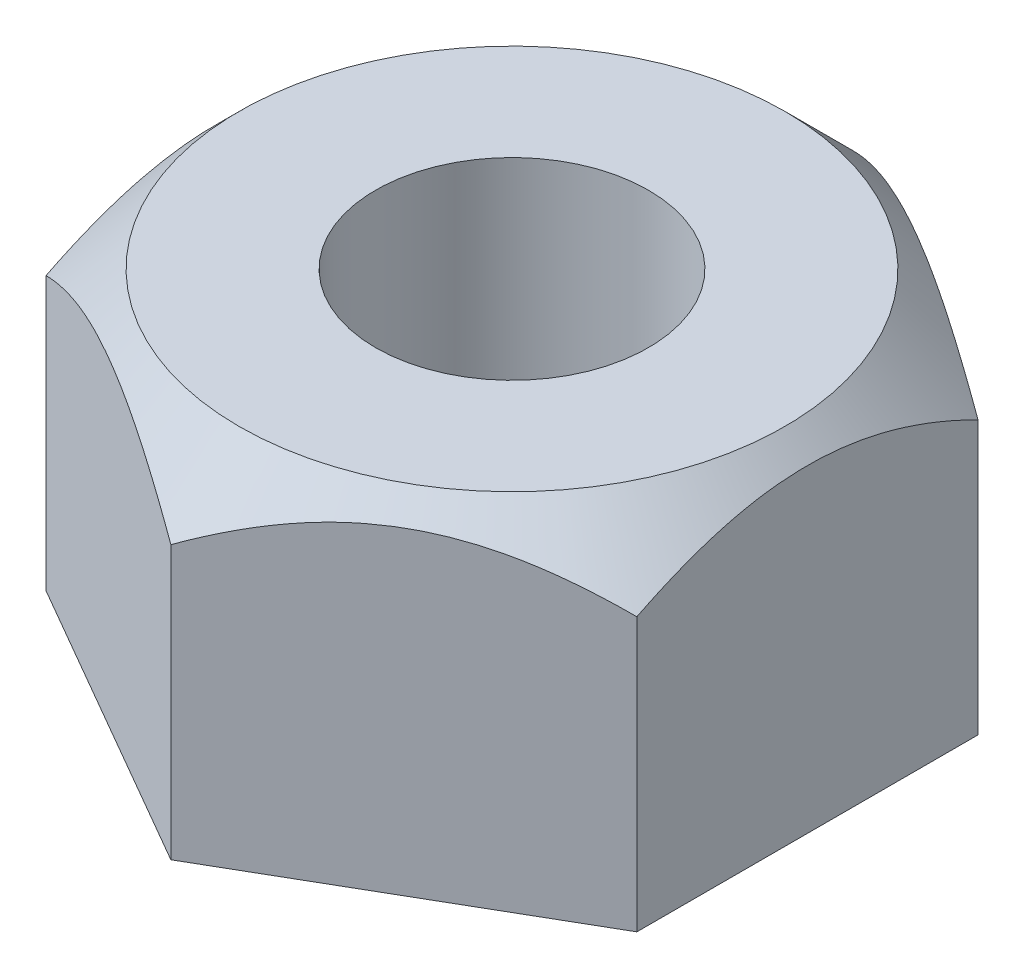
ISO-10303-21;
HEADER;
FILE_DESCRIPTION(('STEP AP214'),'2;1');
FILE_NAME('part.step','',(''),(''),'','','');
FILE_SCHEMA(('AUTOMOTIVE_DESIGN { 1 0 10303 214 1 1 1 1 }'));
ENDSEC;
DATA;
#1=APPLICATION_CONTEXT('core data for automotive mechanical design processes');
#2=APPLICATION_PROTOCOL_DEFINITION('international standard','automotive_design',2000,#1);
#3=PRODUCT_CONTEXT('',#1,'mechanical');
#4=PRODUCT('Part','Part','',(#3));
#5=PRODUCT_RELATED_PRODUCT_CATEGORY('part','',(#4));
#6=PRODUCT_DEFINITION_FORMATION('','',#4);
#7=PRODUCT_DEFINITION_CONTEXT('part definition',#1,'design');
#8=PRODUCT_DEFINITION('design','',#6,#7);
#9=PRODUCT_DEFINITION_SHAPE('','',#8);
#10=(LENGTH_UNIT() NAMED_UNIT(*) SI_UNIT(.MILLI.,.METRE.));
#11=(NAMED_UNIT(*) PLANE_ANGLE_UNIT() SI_UNIT($,.RADIAN.));
#12=(NAMED_UNIT(*) SI_UNIT($,.STERADIAN.) SOLID_ANGLE_UNIT());
#13=UNCERTAINTY_MEASURE_WITH_UNIT(LENGTH_MEASURE(1.E-05),#10,'distance_accuracy_value','');
#14=(GEOMETRIC_REPRESENTATION_CONTEXT(3) GLOBAL_UNCERTAINTY_ASSIGNED_CONTEXT((#13)) GLOBAL_UNIT_ASSIGNED_CONTEXT((#10,
#11,#12)) REPRESENTATION_CONTEXT('',''));
#15=CARTESIAN_POINT('',(0.,0.,0.));
#16=DIRECTION('',(0.,0.,1.));
#17=DIRECTION('',(1.,0.,0.));
#18=AXIS2_PLACEMENT_3D('',#15,#16,#17);
#19=CARTESIAN_POINT('',(0.,5.,0.));
#20=DIRECTION('',(0.,1.,0.));
#21=DIRECTION('',(0.,0.,1.));
#22=AXIS2_PLACEMENT_3D('',#19,#20,#21);
#23=PLANE('',#22);
#24=CARTESIAN_POINT('',(0.,5.,0.));
#25=DIRECTION('',(0.,-1.,0.));
#26=DIRECTION('',(0.,0.,-1.));
#27=AXIS2_PLACEMENT_3D('',#24,#25,#26);
#28=CIRCLE('',#27,3.99999999999996);
#29=CARTESIAN_POINT('',(0.,5.,-4.));
#30=VERTEX_POINT('',#29);
#31=EDGE_CURVE('E222',#30,#30,#28,.T.);
#32=ORIENTED_EDGE('',*,*,#31,.F.);
#33=EDGE_LOOP('',(#32));
#34=FACE_BOUND('',#33,.T.);
#35=CARTESIAN_POINT('',(0.,5.,0.));
#36=DIRECTION('',(0.,1.,0.));
#37=DIRECTION('',(0.,0.,1.));
#38=AXIS2_PLACEMENT_3D('',#35,#36,#37);
#39=CIRCLE('',#38,2.);
#40=CARTESIAN_POINT('',(0.,5.,2.));
#41=VERTEX_POINT('',#40);
#42=EDGE_CURVE('E137',#41,#41,#39,.T.);
#43=ORIENTED_EDGE('',*,*,#42,.F.);
#44=EDGE_LOOP('',(#43));
#45=FACE_BOUND('',#44,.T.);
#46=ADVANCED_FACE('F38',(#34,#45),#23,.T.);
#47=CARTESIAN_POINT('',(0.,0.,0.));
#48=DIRECTION('',(0.,1.,0.));
#49=DIRECTION('',(0.,0.,1.));
#50=AXIS2_PLACEMENT_3D('',#47,#48,#49);
#51=PLANE('',#50);
#52=DIRECTION('',(-0.866025403784441,0.,-0.499999999999995));
#53=VECTOR('',#52,1.);
#54=CARTESIAN_POINT('',(4.33012701892216,0.,-2.50000000000005));
#55=LINE('',#54,#53);
#56=CARTESIAN_POINT('',(4.33012701892216,0.,-2.50000000000005));
#57=VERTEX_POINT('',#56);
#58=CARTESIAN_POINT('',(0.,0.,-5.));
#59=VERTEX_POINT('',#58);
#60=EDGE_CURVE('E113',#57,#59,#55,.T.);
#61=ORIENTED_EDGE('',*,*,#60,.F.);
#62=DIRECTION('',(0.,0.,-1.));
#63=VECTOR('',#62,1.);
#64=CARTESIAN_POINT('',(4.33012701892222,0.,2.49999999999996));
#65=LINE('',#64,#63);
#66=CARTESIAN_POINT('',(4.33012701892222,0.,2.49999999999996));
#67=VERTEX_POINT('',#66);
#68=EDGE_CURVE('E123',#67,#57,#65,.T.);
#69=ORIENTED_EDGE('',*,*,#68,.F.);
#70=DIRECTION('',(0.866025403784434,0.,-0.500000000000007));
#71=VECTOR('',#70,1.);
#72=CARTESIAN_POINT('',(0.,0.,5.));
#73=LINE('',#72,#71);
#74=CARTESIAN_POINT('',(0.,0.,5.));
#75=VERTEX_POINT('',#74);
#76=EDGE_CURVE('E125',#75,#67,#73,.T.);
#77=ORIENTED_EDGE('',*,*,#76,.F.);
#78=DIRECTION('',(0.866025403784441,0.,0.499999999999995));
#79=VECTOR('',#78,1.);
#80=CARTESIAN_POINT('',(-4.33012701892218,0.,2.50000000000002));
#81=LINE('',#80,#79);
#82=CARTESIAN_POINT('',(-4.33012701892218,0.,2.50000000000002));
#83=VERTEX_POINT('',#82);
#84=EDGE_CURVE('E128',#83,#75,#81,.T.);
#85=ORIENTED_EDGE('',*,*,#84,.F.);
#86=DIRECTION('',(0.,0.,1.));
#87=VECTOR('',#86,1.);
#88=CARTESIAN_POINT('',(-4.3301270189222,0.,-2.49999999999999));
#89=LINE('',#88,#87);
#90=CARTESIAN_POINT('',(-4.3301270189222,0.,-2.49999999999999));
#91=VERTEX_POINT('',#90);
#92=EDGE_CURVE('E131',#91,#83,#89,.T.);
#93=ORIENTED_EDGE('',*,*,#92,.F.);
#94=DIRECTION('',(-0.866025403784438,0.,0.500000000000001));
#95=VECTOR('',#94,1.);
#96=CARTESIAN_POINT('',(0.,0.,-5.));
#97=LINE('',#96,#95);
#98=EDGE_CURVE('E134',#59,#91,#97,.T.);
#99=ORIENTED_EDGE('',*,*,#98,.F.);
#100=EDGE_LOOP('',(#61,#69,#77,#85,#93,#99));
#101=FACE_BOUND('',#100,.T.);
#102=CARTESIAN_POINT('',(0.,0.,0.));
#103=DIRECTION('',(0.,1.,0.));
#104=DIRECTION('',(0.,0.,1.));
#105=AXIS2_PLACEMENT_3D('',#102,#103,#104);
#106=CIRCLE('',#105,2.);
#107=CARTESIAN_POINT('',(0.,0.,2.));
#108=VERTEX_POINT('',#107);
#109=EDGE_CURVE('E102',#108,#108,#106,.T.);
#110=ORIENTED_EDGE('',*,*,#109,.T.);
#111=EDGE_LOOP('',(#110));
#112=FACE_BOUND('',#111,.T.);
#113=ADVANCED_FACE('F191',(#101,#112),#51,.F.);
#114=CARTESIAN_POINT('',(4.33012701892216,5.,-2.50000000000005));
#115=DIRECTION('',(-0.499999999999995,0.,0.866025403784441));
#116=DIRECTION('',(0.866025403784441,0.,0.499999999999995));
#117=AXIS2_PLACEMENT_3D('',#114,#115,#116);
#118=PLANE('',#117);
#119=DIRECTION('',(0.,-1.,0.));
#120=VECTOR('',#119,1.);
#121=CARTESIAN_POINT('',(0.,5.,-5.));
#122=LINE('',#121,#120);
#123=CARTESIAN_POINT('',(0.,4.,-5.));
#124=VERTEX_POINT('',#123);
#125=EDGE_CURVE('E53',#124,#59,#122,.T.);
#126=ORIENTED_EDGE('',*,*,#125,.F.);
#127=CARTESIAN_POINT('',(-0.0002,3.99988452594625,-5.00011547005384));
#128=CARTESIAN_POINT('',(0.0742554090707049,4.04286790141724,-4.95712861958424));
#129=CARTESIAN_POINT('',(0.149283126568601,4.08453221602492,-4.91381134669015));
#130=CARTESIAN_POINT('',(0.300595465189509,4.16482145708143,-4.82645112725566));
#131=CARTESIAN_POINT('',(0.376880745694235,4.20344472346906,-4.78240780002105));
#132=CARTESIAN_POINT('',(0.608500126942155,4.31448044206776,-4.64868228790803));
#133=CARTESIAN_POINT('',(0.765795048817964,4.38158509551093,-4.55786802242087));
#134=CARTESIAN_POINT('',(1.08299287715965,4.49649734778531,-4.37473377084144));
#135=CARTESIAN_POINT('',(1.24281470248161,4.54459446311372,-4.28246059696943));
#136=CARTESIAN_POINT('',(1.48517508809477,4.60023112471791,-4.14253376309477));
#137=CARTESIAN_POINT('',(1.56631871630185,4.616017735568,-4.09568546750639));
#138=CARTESIAN_POINT('',(1.72929306006518,4.6417307019677,-4.00159218626363));
#139=CARTESIAN_POINT('',(1.81112367107163,4.65165793340976,-3.9543472609711));
#140=CARTESIAN_POINT('',(2.0105305936331,4.66830217314388,-3.83921962055197));
#141=CARTESIAN_POINT('',(2.12832175242251,4.67179465880338,-3.77121286331674));
#142=CARTESIAN_POINT('',(2.36369180162404,4.66593410386714,-3.63532190205107));
#143=CARTESIAN_POINT('',(2.48127060316034,4.65657656026427,-3.56743774933309));
#144=CARTESIAN_POINT('',(2.71531972801062,4.62556753841816,-3.43230942409718));
#145=CARTESIAN_POINT('',(2.83178866321259,4.6039023105296,-3.3650660530061));
#146=CARTESIAN_POINT('',(3.06272472930427,4.54945578592571,-3.23173505308248));
#147=CARTESIAN_POINT('',(3.17719201297257,4.51667534152197,-3.16564733604318));
#148=CARTESIAN_POINT('',(3.38039775482073,4.44923386131425,-3.04832644628627));
#149=CARTESIAN_POINT('',(3.46958605899213,4.41634609377105,-2.99683355486435));
#150=CARTESIAN_POINT('',(3.64636152947374,4.34527048015554,-2.89477218939567));
#151=CARTESIAN_POINT('',(3.73394864701728,4.30708247295943,-2.84420374350436));
#152=CARTESIAN_POINT('',(3.90724588546534,4.22626249862793,-2.74415053623656));
#153=CARTESIAN_POINT('',(3.99296093516109,4.18364450612329,-2.69466292922111));
#154=CARTESIAN_POINT('',(4.16280372218375,4.09452416373329,-2.59660415041366));
#155=CARTESIAN_POINT('',(4.24693239497665,4.04802419677493,-2.54803243853012));
#156=CARTESIAN_POINT('',(4.33032701892216,3.99988452594623,-2.49988452994621));
#157=B_SPLINE_CURVE_WITH_KNOTS('',3,(#127,#128,#129,#130,#131,#132,#133,#134,#135,#136,#137,
#138,#139,#140,#141,#142,#143,#144,#145,#146,#147,#148,#149,#150,#151,#152,#153,#154,#155,#156),
.UNSPECIFIED.,.F.,.F.,(4,2,2,2,2,2,2,2,2,2,2,2,2,2,4),(0.,0.288343025050057,0.576842376266659,
1.1569560499233,1.72785747296509,2.01274823950899,2.29759640821259,2.70513724110399,
3.11282092407134,3.52096095288673,3.92906969271699,4.25324617843564,4.57743252106517,
4.90062556888116,5.22362166510132),.UNSPECIFIED.);
#158=CARTESIAN_POINT('',(4.33012701892216,4.,-2.50000000000001));
#159=VERTEX_POINT('',#158);
#160=EDGE_CURVE('E96',#124,#159,#157,.T.);
#161=ORIENTED_EDGE('',*,*,#160,.T.);
#162=DIRECTION('',(0.,-1.,0.));
#163=VECTOR('',#162,1.);
#164=CARTESIAN_POINT('',(4.33012701892216,5.,-2.50000000000005));
#165=LINE('',#164,#163);
#166=EDGE_CURVE('E67',#159,#57,#165,.T.);
#167=ORIENTED_EDGE('',*,*,#166,.T.);
#168=ORIENTED_EDGE('',*,*,#60,.T.);
#169=EDGE_LOOP('',(#126,#161,#167,#168));
#170=FACE_BOUND('',#169,.T.);
#171=ADVANCED_FACE('F40',(#170),#118,.F.);
#172=CARTESIAN_POINT('',(0.,5.,-5.));
#173=DIRECTION('',(0.500000000000001,0.,0.866025403784438));
#174=DIRECTION('',(0.866025403784438,0.,-0.500000000000001));
#175=AXIS2_PLACEMENT_3D('',#172,#173,#174);
#176=PLANE('',#175);
#177=DIRECTION('',(0.,-1.,0.));
#178=VECTOR('',#177,1.);
#179=CARTESIAN_POINT('',(-4.3301270189222,5.,-2.49999999999999));
#180=LINE('',#179,#178);
#181=CARTESIAN_POINT('',(-4.3301270189222,4.,-2.49999999999995));
#182=VERTEX_POINT('',#181);
#183=EDGE_CURVE('E109',#182,#91,#180,.T.);
#184=ORIENTED_EDGE('',*,*,#183,.F.);
#185=CARTESIAN_POINT('',(-4.3303270189222,3.99988452594623,-2.49988452994615));
#186=CARTESIAN_POINT('',(-4.25587160985149,4.04286790141722,-2.54287138041575));
#187=CARTESIAN_POINT('',(-4.18084389235359,4.08453221602491,-2.58618865330984));
#188=CARTESIAN_POINT('',(-4.02953155373268,4.16482145708142,-2.67354887274434));
#189=CARTESIAN_POINT('',(-3.95324627322796,4.20344472346905,-2.71759219997895));
#190=CARTESIAN_POINT('',(-3.72162689198003,4.31448044206776,-2.85131771209197));
#191=CARTESIAN_POINT('',(-3.56433197010422,4.38158509551093,-2.94213197757913));
#192=CARTESIAN_POINT('',(-3.24713414176253,4.49649734778531,-3.12526622915858));
#193=CARTESIAN_POINT('',(-3.08731231644056,4.54459446311372,-3.21753940303059));
#194=CARTESIAN_POINT('',(-2.84495193082739,4.60023112471792,-3.35746623690525));
#195=CARTESIAN_POINT('',(-2.76380830262031,4.61601773556801,-3.40431453249364));
#196=CARTESIAN_POINT('',(-2.60083395885698,4.64173070196772,-3.4984078137364));
#197=CARTESIAN_POINT('',(-2.51900334785053,4.65165793340977,-3.54565273902892));
#198=CARTESIAN_POINT('',(-2.31959642528906,4.6683021731439,-3.66078037944806));
#199=CARTESIAN_POINT('',(-2.20180526649965,4.67179465880339,-3.72878713668329));
#200=CARTESIAN_POINT('',(-1.96643521729812,4.66593410386716,-3.86467809794896));
#201=CARTESIAN_POINT('',(-1.84885641576182,4.65657656026429,-3.93256225066694));
#202=CARTESIAN_POINT('',(-1.61480729091154,4.62556753841818,-4.06769057590285));
#203=CARTESIAN_POINT('',(-1.49833835570958,4.60390231052962,-4.13493394699393));
#204=CARTESIAN_POINT('',(-1.26740228961789,4.54945578592573,-4.26826494691756));
#205=CARTESIAN_POINT('',(-1.1529350059496,4.51667534152199,-4.33435266395685));
#206=CARTESIAN_POINT('',(-0.949729264101441,4.44923386131427,-4.45167355371377));
#207=CARTESIAN_POINT('',(-0.860540959930038,4.41634609377107,-4.50316644513569));
#208=CARTESIAN_POINT('',(-0.68376548944843,4.34527048015556,-4.60522781060437));
#209=CARTESIAN_POINT('',(-0.596178371904884,4.30708247295946,-4.65579625649568));
#210=CARTESIAN_POINT('',(-0.422881133456828,4.22626249862795,-4.75584946376349));
#211=CARTESIAN_POINT('',(-0.337166083761076,4.18364450612331,-4.80533707077893));
#212=CARTESIAN_POINT('',(-0.16732329673841,4.09452416373332,-4.90339584958638));
#213=CARTESIAN_POINT('',(-0.0831946239455089,4.04802419677496,-4.95196756146993));
#214=CARTESIAN_POINT('',(0.000200000000000395,3.99988452594625,-5.00011547005384));
#215=B_SPLINE_CURVE_WITH_KNOTS('',3,(#185,#186,#187,#188,#189,#190,#191,#192,#193,#194,#195,
#196,#197,#198,#199,#200,#201,#202,#203,#204,#205,#206,#207,#208,#209,#210,#211,#212,#213,#214),
.UNSPECIFIED.,.F.,.F.,(4,2,2,2,2,2,2,2,2,2,2,2,2,2,4),(0.,0.288343025050065,0.576842376266673,
1.15695604992333,1.72785747296514,2.01274823950905,2.29759640821265,2.70513724110406,
3.11282092407141,3.52096095288679,3.92906969271705,4.2532461784357,4.57743252106523,
4.90062556888122,5.22362166510139),.UNSPECIFIED.);
#216=EDGE_CURVE('E99',#182,#124,#215,.T.);
#217=ORIENTED_EDGE('',*,*,#216,.T.);
#218=ORIENTED_EDGE('',*,*,#125,.T.);
#219=ORIENTED_EDGE('',*,*,#98,.T.);
#220=EDGE_LOOP('',(#184,#217,#218,#219));
#221=FACE_BOUND('',#220,.T.);
#222=ADVANCED_FACE('F106',(#221),#176,.F.);
#223=CARTESIAN_POINT('',(-4.3301270189222,5.,-2.49999999999999));
#224=DIRECTION('',(1.,0.,0.));
#225=DIRECTION('',(0.,0.,-1.));
#226=AXIS2_PLACEMENT_3D('',#223,#224,#225);
#227=PLANE('',#226);
#228=DIRECTION('',(0.,-1.,0.));
#229=VECTOR('',#228,1.);
#230=CARTESIAN_POINT('',(-4.33012701892218,5.,2.50000000000002));
#231=LINE('',#230,#229);
#232=CARTESIAN_POINT('',(-4.33012701892207,4.,2.50000000000009));
#233=VERTEX_POINT('',#232);
#234=EDGE_CURVE('E114',#233,#83,#231,.T.);
#235=ORIENTED_EDGE('',*,*,#234,.F.);
#236=CARTESIAN_POINT('',(-4.33012701892217,0.253678646666877,7.59921951359281));
#237=CARTESIAN_POINT('',(-4.33012701892217,0.351184265632849,7.48699247756584));
#238=CARTESIAN_POINT('',(-4.33012701892217,0.448391375057718,7.37450605913899));
#239=CARTESIAN_POINT('',(-4.33012701892217,0.642124786155439,7.14894544849835));
#240=CARTESIAN_POINT('',(-4.33012701892217,0.738651076776384,7.03587124679443));
#241=CARTESIAN_POINT('',(-4.33012701892217,1.02716624616897,6.69556519020096));
#242=CARTESIAN_POINT('',(-4.33012701892217,1.21800207958187,6.46735241242825));
#243=CARTESIAN_POINT('',(-4.33012701892217,1.59990517797504,6.00244910758806));
#244=CARTESIAN_POINT('',(-4.33012701892217,1.79088117220909,5.76568333547583));
#245=CARTESIAN_POINT('',(-4.33012701892217,2.16711212032232,5.28773027314546));
#246=CARTESIAN_POINT('',(-4.33012701892217,2.35236849100331,5.04654410187624));
#247=CARTESIAN_POINT('',(-4.33012701892217,2.71525397312859,4.55795427576487));
#248=CARTESIAN_POINT('',(-4.33012701892218,2.89287299343635,4.31054304061882));
#249=CARTESIAN_POINT('',(-4.33012701892218,3.15077503816679,3.93341818828449));
#250=CARTESIAN_POINT('',(-4.33012701892218,3.23535920031472,3.80664733518686));
#251=CARTESIAN_POINT('',(-4.33012701892218,3.40099683530629,3.55082533863258));
#252=CARTESIAN_POINT('',(-4.33012701892218,3.48205061253224,3.42177439311459));
#253=CARTESIAN_POINT('',(-4.33012701892218,3.63925189418196,3.16199806432159));
#254=CARTESIAN_POINT('',(-4.33012701892218,3.7154310235147,3.03129190461665));
#255=CARTESIAN_POINT('',(-4.33012701892218,3.86251884492208,2.7669085874914));
#256=CARTESIAN_POINT('',(-4.33012701892218,3.93342690129371,2.63323107423656));
#257=CARTESIAN_POINT('',(-4.33012701892218,4.06857379693264,2.36276633080915));
#258=CARTESIAN_POINT('',(-4.33012701892218,4.13282229705243,2.22598396638433));
#259=CARTESIAN_POINT('',(-4.33012701892218,4.25314426880829,1.94889793365953));
#260=CARTESIAN_POINT('',(-4.33012701892218,4.30922090004818,1.80859565104085));
#261=CARTESIAN_POINT('',(-4.33012701892218,4.41248158383951,1.5210910162557));
#262=CARTESIAN_POINT('',(-4.33012701892219,4.459434008593,1.37380428933832));
#263=CARTESIAN_POINT('',(-4.33012701892219,4.54055726771458,1.07571750853242));
#264=CARTESIAN_POINT('',(-4.33012701892219,4.57473013843067,0.924918018453896));
#265=CARTESIAN_POINT('',(-4.33012701892219,4.62800973590169,0.621622317866126));
#266=CARTESIAN_POINT('',(-4.33012701892219,4.64721141825836,0.469143126259003));
#267=CARTESIAN_POINT('',(-4.33012701892219,4.66949383146878,0.163002209399457));
#268=CARTESIAN_POINT('',(-4.33012701892219,4.67257642516733,0.00934062284924474));
#269=CARTESIAN_POINT('',(-4.33012701892219,4.66237027194922,-0.297696033322777));
#270=CARTESIAN_POINT('',(-4.33012701892219,4.64905273739304,-0.451070124483334));
#271=CARTESIAN_POINT('',(-4.33012701892219,4.6070212422452,-0.755678508307873));
#272=CARTESIAN_POINT('',(-4.33012701892219,4.57830417588683,-0.906912363013293));
#273=CARTESIAN_POINT('',(-4.33012701892219,4.50712812371406,-1.20721128847463));
#274=CARTESIAN_POINT('',(-4.3301270189222,4.46457099038751,-1.35625267713974));
#275=CARTESIAN_POINT('',(-4.3301270189222,4.36805262314037,-1.65053794073625));
#276=CARTESIAN_POINT('',(-4.3301270189222,4.31409117797903,-1.79578174526944));
#277=CARTESIAN_POINT('',(-4.3301270189222,4.18441751502987,-2.11307073215614));
#278=CARTESIAN_POINT('',(-4.3301270189222,4.10652126399939,-2.28421549179873));
#279=CARTESIAN_POINT('',(-4.3301270189222,3.94032519516517,-2.62142059572486));
#280=CARTESIAN_POINT('',(-4.3301270189222,3.85201941400982,-2.78747795627216));
#281=CARTESIAN_POINT('',(-4.3301270189222,3.66731103609871,-3.11543948043555));
#282=CARTESIAN_POINT('',(-4.3301270189222,3.57089216867296,-3.27733440507162));
#283=CARTESIAN_POINT('',(-4.3301270189222,3.3719729247574,-3.59727339089179));
#284=CARTESIAN_POINT('',(-4.3301270189222,3.26947374655535,-3.75531820223987));
#285=CARTESIAN_POINT('',(-4.3301270189222,3.05916109783683,-4.06905173475921));
#286=CARTESIAN_POINT('',(-4.3301270189222,2.95132197417666,-4.22472317767926));
#287=CARTESIAN_POINT('',(-4.33012701892221,2.73185307244256,-4.53336890520683));
#288=CARTESIAN_POINT('',(-4.33012701892221,2.6202231588763,-4.68634309311017));
#289=CARTESIAN_POINT('',(-4.33012701892221,2.39406517485042,-4.98984972858034));
#290=CARTESIAN_POINT('',(-4.33012701892221,2.27954064324082,-5.14038482040814));
#291=CARTESIAN_POINT('',(-4.33012701892221,2.04803503761645,-5.43955784308427));
#292=CARTESIAN_POINT('',(-4.33012701892221,1.93105388249028,-5.58819571102981));
#293=CARTESIAN_POINT('',(-4.33012701892221,1.68603900594879,-5.89518635745016));
#294=CARTESIAN_POINT('',(-4.33012701892221,1.55784508755709,-6.05341108869284));
#295=CARTESIAN_POINT('',(-4.33012701892221,1.29954321420474,-6.36829125211622));
#296=CARTESIAN_POINT('',(-4.33012701892221,1.16943523517162,-6.52494666451842));
#297=CARTESIAN_POINT('',(-4.33012701892221,0.909100774007249,-6.83518118684619));
#298=CARTESIAN_POINT('',(-4.33012701892221,0.778891912024043,-6.98877510446432));
#299=CARTESIAN_POINT('',(-4.33012701892221,0.51719336283557,-7.29480873067968));
#300=CARTESIAN_POINT('',(-4.33012701892221,0.385703969827631,-7.4472486907282));
#301=CARTESIAN_POINT('',(-4.33012701892221,0.253678646666957,-7.59921951359278));
#302=B_SPLINE_CURVE_WITH_KNOTS('',3,(#236,#237,#238,#239,#240,#241,#242,#243,#244,#245,#246,
#247,#248,#249,#250,#251,#252,#253,#254,#255,#256,#257,#258,#259,#260,#261,#262,#263,#264,#265,
#266,#267,#268,#269,#270,#271,#272,#273,#274,#275,#276,#277,#278,#279,#280,#281,#282,#283,#284,
#285,#286,#287,#288,#289,#290,#291,#292,#293,#294,#295,#296,#297,#298,#299,#300,#301),
.UNSPECIFIED.,.F.,.F.,(4,2,2,2,2,2,2,2,2,2,2,2,2,2,2,2,2,2,2,2,2,2,2,2,2,2,2,2,2,2,2,2,4),(0.,
0.446003957696263,0.892015138902993,1.7844454520532,2.69694127159322,3.60920921409762,
4.52264764303549,4.97979846611422,5.43690979628033,5.89066842739228,6.3444816943095,
6.79762713021699,7.25059689265082,7.71388352952144,8.1770963128597,8.63734668751585,
9.09754387095332,9.55855000507361,10.0196491495725,10.4840922330261,10.9485439200596,
11.5121821150825,12.0761447876207,12.6412667411846,13.2062776900008,13.7743322928723,
14.3424072208553,14.9098183649613,15.4772482730702,16.0881462572516,16.6990519310607,
17.303121069493,17.9070545540327),.UNSPECIFIED.);
#303=EDGE_CURVE('E110',#233,#182,#302,.T.);
#304=ORIENTED_EDGE('',*,*,#303,.T.);
#305=ORIENTED_EDGE('',*,*,#183,.T.);
#306=ORIENTED_EDGE('',*,*,#92,.T.);
#307=EDGE_LOOP('',(#235,#304,#305,#306));
#308=FACE_BOUND('',#307,.T.);
#309=ADVANCED_FACE('F180',(#308),#227,.F.);
#310=CARTESIAN_POINT('',(-4.33012701892218,5.,2.50000000000002));
#311=DIRECTION('',(0.499999999999995,0.,-0.866025403784442));
#312=DIRECTION('',(-0.866025403784442,0.,-0.499999999999995));
#313=AXIS2_PLACEMENT_3D('',#310,#311,#312);
#314=PLANE('',#313);
#315=DIRECTION('',(0.,-1.,0.));
#316=VECTOR('',#315,1.);
#317=CARTESIAN_POINT('',(0.,5.,5.));
#318=LINE('',#317,#316);
#319=CARTESIAN_POINT('',(1.88651178012478E-13,4.,4.99999999999991));
#320=VERTEX_POINT('',#319);
#321=EDGE_CURVE('E118',#320,#75,#318,.T.);
#322=ORIENTED_EDGE('',*,*,#321,.F.);
#323=CARTESIAN_POINT('',(0.000200000000034515,3.99988452594617,5.00011547005384));
#324=CARTESIAN_POINT('',(-0.0742554090706722,4.04286790141715,4.95712861958424));
#325=CARTESIAN_POINT('',(-0.149283126568571,4.08453221602484,4.91381134669015));
#326=CARTESIAN_POINT('',(-0.300595465189481,4.16482145708135,4.82645112725565));
#327=CARTESIAN_POINT('',(-0.376880745694209,4.20344472346898,4.78240780002104));
#328=CARTESIAN_POINT('',(-0.608500126942136,4.31448044206769,4.64868228790802));
#329=CARTESIAN_POINT('',(-0.765795048817949,4.38158509551086,4.55786802242086));
#330=CARTESIAN_POINT('',(-1.08299287715965,4.49649734778524,4.37473377084142));
#331=CARTESIAN_POINT('',(-1.24281470248161,4.54459446311365,4.28246059696941));
#332=CARTESIAN_POINT('',(-1.48517508809478,4.60023112471785,4.14253376309474));
#333=CARTESIAN_POINT('',(-1.56631871630186,4.61601773556794,4.09568546750636));
#334=CARTESIAN_POINT('',(-1.72929306006519,4.64173070196764,4.0015921862636));
#335=CARTESIAN_POINT('',(-1.81112367107165,4.6516579334097,3.95434726097107));
#336=CARTESIAN_POINT('',(-2.01053059363312,4.66830217314382,3.83921962055194));
#337=CARTESIAN_POINT('',(-2.12832175242253,4.67179465880332,3.77121286331671));
#338=CARTESIAN_POINT('',(-2.36369180162406,4.66593410386708,3.63532190205103));
#339=CARTESIAN_POINT('',(-2.48127060316037,4.65657656026421,3.56743774933306));
#340=CARTESIAN_POINT('',(-2.71531972801065,4.6255675384181,3.43230942409715));
#341=CARTESIAN_POINT('',(-2.83178866321262,4.60390231052954,3.36506605300606));
#342=CARTESIAN_POINT('',(-3.06272472930431,4.54945578592565,3.23173505308244));
#343=CARTESIAN_POINT('',(-3.1771920129726,4.51667534152191,3.16564733604314));
#344=CARTESIAN_POINT('',(-3.38039775482076,4.44923386131419,3.04832644628623));
#345=CARTESIAN_POINT('',(-3.46958605899216,4.41634609377099,2.99683355486431));
#346=CARTESIAN_POINT('',(-3.64636152947377,4.34527048015548,2.89477218939563));
#347=CARTESIAN_POINT('',(-3.73394864701731,4.30708247295938,2.84420374350432));
#348=CARTESIAN_POINT('',(-3.90724588546536,4.22626249862788,2.74415053623652));
#349=CARTESIAN_POINT('',(-3.99296093516111,4.18364450612324,2.69466292922108));
#350=CARTESIAN_POINT('',(-4.16280372218378,4.09452416373325,2.59660415041363));
#351=CARTESIAN_POINT('',(-4.24693239497667,4.04802419677489,2.54803243853009));
#352=CARTESIAN_POINT('',(-4.33032701892218,3.99988452594619,2.49988452994618));
#353=B_SPLINE_CURVE_WITH_KNOTS('',3,(#323,#324,#325,#326,#327,#328,#329,#330,#331,#332,#333,
#334,#335,#336,#337,#338,#339,#340,#341,#342,#343,#344,#345,#346,#347,#348,#349,#350,#351,#352),
.UNSPECIFIED.,.F.,.F.,(4,2,2,2,2,2,2,2,2,2,2,2,2,2,4),(0.,0.288343025050065,0.576842376266674,
1.15695604992333,1.72785747296514,2.01274823950905,2.29759640821266,2.70513724110407,
3.11282092407142,3.52096095288681,3.92906969271708,4.25324617843572,4.57743252106525,
4.90062556888123,5.22362166510139),.UNSPECIFIED.);
#354=EDGE_CURVE('E169',#320,#233,#353,.T.);
#355=ORIENTED_EDGE('',*,*,#354,.T.);
#356=ORIENTED_EDGE('',*,*,#234,.T.);
#357=ORIENTED_EDGE('',*,*,#84,.T.);
#358=EDGE_LOOP('',(#322,#355,#356,#357));
#359=FACE_BOUND('',#358,.T.);
#360=ADVANCED_FACE('F183',(#359),#314,.F.);
#361=CARTESIAN_POINT('',(0.,5.,5.));
#362=DIRECTION('',(-0.500000000000007,0.,-0.866025403784435));
#363=DIRECTION('',(-0.866025403784435,0.,0.500000000000007));
#364=AXIS2_PLACEMENT_3D('',#361,#362,#363);
#365=PLANE('',#364);
#366=DIRECTION('',(0.,-1.,0.));
#367=VECTOR('',#366,1.);
#368=CARTESIAN_POINT('',(4.33012701892222,5.,2.49999999999996));
#369=LINE('',#368,#367);
#370=CARTESIAN_POINT('',(4.33012701892222,4.,2.49999999999996));
#371=VERTEX_POINT('',#370);
#372=EDGE_CURVE('E120',#371,#67,#369,.T.);
#373=ORIENTED_EDGE('',*,*,#372,.F.);
#374=CARTESIAN_POINT('',(4.33032701892222,3.99988452594619,2.49988452994612));
#375=CARTESIAN_POINT('',(4.25587160985151,4.04286790141717,2.54287138041572));
#376=CARTESIAN_POINT('',(4.18084389235361,4.08453221602486,2.58618865330981));
#377=CARTESIAN_POINT('',(4.02953155373271,4.16482145708137,2.67354887274431));
#378=CARTESIAN_POINT('',(3.95324627322798,4.203444723469,2.71759219997892));
#379=CARTESIAN_POINT('',(3.72162689198006,4.3144804420677,2.85131771209194));
#380=CARTESIAN_POINT('',(3.56433197010425,4.38158509551087,2.9421319775791));
#381=CARTESIAN_POINT('',(3.24713414176256,4.49649734778524,3.12526622915854));
#382=CARTESIAN_POINT('',(3.0873123164406,4.54459446311366,3.21753940303056));
#383=CARTESIAN_POINT('',(2.84495193082744,4.60023112471785,3.35746623690522));
#384=CARTESIAN_POINT('',(2.76380830262036,4.61601773556794,3.4043145324936));
#385=CARTESIAN_POINT('',(2.60083395885703,4.64173070196764,3.49840781373636));
#386=CARTESIAN_POINT('',(2.51900334785058,4.6516579334097,3.54565273902889));
#387=CARTESIAN_POINT('',(2.31959642528911,4.66830217314382,3.66078037944803));
#388=CARTESIAN_POINT('',(2.2018052664997,4.67179465880332,3.72878713668326));
#389=CARTESIAN_POINT('',(1.96643521729817,4.66593410386708,3.86467809794894));
#390=CARTESIAN_POINT('',(1.84885641576187,4.65657656026421,3.93256225066692));
#391=CARTESIAN_POINT('',(1.61480729091158,4.6255675384181,4.06769057590283));
#392=CARTESIAN_POINT('',(1.49833835570962,4.60390231052954,4.13493394699392));
#393=CARTESIAN_POINT('',(1.26740228961793,4.54945578592565,4.26826494691754));
#394=CARTESIAN_POINT('',(1.15293500594964,4.51667534152191,4.33435266395684));
#395=CARTESIAN_POINT('',(0.949729264101477,4.44923386131418,4.45167355371376));
#396=CARTESIAN_POINT('',(0.860540959930073,4.41634609377099,4.50316644513568));
#397=CARTESIAN_POINT('',(0.683765489448465,4.34527048015548,4.60522781060436));
#398=CARTESIAN_POINT('',(0.596178371904918,4.30708247295937,4.65579625649568));
#399=CARTESIAN_POINT('',(0.422881133456862,4.22626249862787,4.75584946376348));
#400=CARTESIAN_POINT('',(0.33716608376111,4.18364450612322,4.80533707077893));
#401=CARTESIAN_POINT('',(0.167323296738444,4.09452416373323,4.90339584958638));
#402=CARTESIAN_POINT('',(0.0831946239455437,4.04802419677487,4.95196756146993));
#403=CARTESIAN_POINT('',(-0.000199999999965556,3.99988452594617,5.00011547005384));
#404=B_SPLINE_CURVE_WITH_KNOTS('',3,(#374,#375,#376,#377,#378,#379,#380,#381,#382,#383,#384,
#385,#386,#387,#388,#389,#390,#391,#392,#393,#394,#395,#396,#397,#398,#399,#400,#401,#402,#403),
.UNSPECIFIED.,.F.,.F.,(4,2,2,2,2,2,2,2,2,2,2,2,2,2,4),(0.,0.28834302505006,0.576842376266664,
1.15695604992331,1.72785747296511,2.01274823950901,2.29759640821261,2.70513724110402,
3.11282092407138,3.52096095288676,3.92906969271703,4.25324617843569,4.57743252106522,
4.90062556888121,5.22362166510139),.UNSPECIFIED.);
#405=EDGE_CURVE('E60',#371,#320,#404,.T.);
#406=ORIENTED_EDGE('',*,*,#405,.T.);
#407=ORIENTED_EDGE('',*,*,#321,.T.);
#408=ORIENTED_EDGE('',*,*,#76,.T.);
#409=EDGE_LOOP('',(#373,#406,#407,#408));
#410=FACE_BOUND('',#409,.T.);
#411=ADVANCED_FACE('F204',(#410),#365,.F.);
#412=CARTESIAN_POINT('',(4.33012701892222,5.,2.49999999999996));
#413=DIRECTION('',(-1.,0.,0.));
#414=DIRECTION('',(0.,0.,1.));
#415=AXIS2_PLACEMENT_3D('',#412,#413,#414);
#416=PLANE('',#415);
#417=ORIENTED_EDGE('',*,*,#166,.F.);
#418=CARTESIAN_POINT('',(4.33012701892211,0.253678646666956,-7.59921951359284));
#419=CARTESIAN_POINT('',(4.33012701892211,0.351184265632925,-7.48699247756588));
#420=CARTESIAN_POINT('',(4.33012701892211,0.448391375057793,-7.37450605913903));
#421=CARTESIAN_POINT('',(4.33012701892211,0.642124786155513,-7.14894544849838));
#422=CARTESIAN_POINT('',(4.33012701892212,0.738651076776457,-7.03587124679447));
#423=CARTESIAN_POINT('',(4.33012701892212,1.02716624616904,-6.695565190201));
#424=CARTESIAN_POINT('',(4.33012701892212,1.21800207958193,-6.46735241242829));
#425=CARTESIAN_POINT('',(4.33012701892213,1.5999051779751,-6.00244910758811));
#426=CARTESIAN_POINT('',(4.33012701892213,1.79088117220915,-5.76568333547588));
#427=CARTESIAN_POINT('',(4.33012701892213,2.16711212032237,-5.28773027314551));
#428=CARTESIAN_POINT('',(4.33012701892214,2.35236849100336,-5.0465441018763));
#429=CARTESIAN_POINT('',(4.33012701892214,2.71525397312863,-4.55795427576493));
#430=CARTESIAN_POINT('',(4.33012701892214,2.89287299343639,-4.31054304061889));
#431=CARTESIAN_POINT('',(4.33012701892215,3.15077503816683,-3.93341818828456));
#432=CARTESIAN_POINT('',(4.33012701892215,3.23535920031476,-3.80664733518693));
#433=CARTESIAN_POINT('',(4.33012701892215,3.40099683530633,-3.55082533863265));
#434=CARTESIAN_POINT('',(4.33012701892215,3.48205061253227,-3.42177439311466));
#435=CARTESIAN_POINT('',(4.33012701892216,3.63925189418199,-3.16199806432166));
#436=CARTESIAN_POINT('',(4.33012701892216,3.71543102351473,-3.03129190461672));
#437=CARTESIAN_POINT('',(4.33012701892216,3.86251884492211,-2.76690858749148));
#438=CARTESIAN_POINT('',(4.33012701892216,3.93342690129373,-2.63323107423663));
#439=CARTESIAN_POINT('',(4.33012701892216,4.06857379693266,-2.36276633080923));
#440=CARTESIAN_POINT('',(4.33012701892217,4.13282229705245,-2.2259839663844));
#441=CARTESIAN_POINT('',(4.33012701892217,4.25314426880831,-1.9488979336596));
#442=CARTESIAN_POINT('',(4.33012701892217,4.3092209000482,-1.80859565104093));
#443=CARTESIAN_POINT('',(4.33012701892217,4.41248158383952,-1.52109101625578));
#444=CARTESIAN_POINT('',(4.33012701892217,4.45943400859301,-1.3738042893384));
#445=CARTESIAN_POINT('',(4.33012701892218,4.54055726771459,-1.07571750853251));
#446=CARTESIAN_POINT('',(4.33012701892218,4.57473013843068,-0.924918018453984));
#447=CARTESIAN_POINT('',(4.33012701892218,4.62800973590169,-0.621622317866216));
#448=CARTESIAN_POINT('',(4.33012701892218,4.64721141825836,-0.469143126259095));
#449=CARTESIAN_POINT('',(4.33012701892219,4.66949383146878,-0.163002209399552));
#450=CARTESIAN_POINT('',(4.33012701892219,4.67257642516733,-0.00934062284934064));
#451=CARTESIAN_POINT('',(4.33012701892219,4.66237027194922,0.297696033322678));
#452=CARTESIAN_POINT('',(4.33012701892219,4.64905273739304,0.451070124483234));
#453=CARTESIAN_POINT('',(4.3301270189222,4.6070212422452,0.75567850830777));
#454=CARTESIAN_POINT('',(4.3301270189222,4.57830417588682,0.906912363013189));
#455=CARTESIAN_POINT('',(4.3301270189222,4.50712812371405,1.20721128847452));
#456=CARTESIAN_POINT('',(4.3301270189222,4.4645709903875,1.35625267713963));
#457=CARTESIAN_POINT('',(4.33012701892221,4.36805262314037,1.65053794073614));
#458=CARTESIAN_POINT('',(4.33012701892221,4.31409117797903,1.79578174526932));
#459=CARTESIAN_POINT('',(4.33012701892221,4.18441751502987,2.11307073215602));
#460=CARTESIAN_POINT('',(4.33012701892221,4.10652126399938,2.28421549179862));
#461=CARTESIAN_POINT('',(4.33012701892222,3.94032519516517,2.62142059572475));
#462=CARTESIAN_POINT('',(4.33012701892222,3.85201941400981,2.78747795627204));
#463=CARTESIAN_POINT('',(4.33012701892222,3.66731103609871,3.11543948043544));
#464=CARTESIAN_POINT('',(4.33012701892222,3.57089216867295,3.27733440507151));
#465=CARTESIAN_POINT('',(4.33012701892223,3.37197292475739,3.59727339089168));
#466=CARTESIAN_POINT('',(4.33012701892223,3.26947374655534,3.75531820223976));
#467=CARTESIAN_POINT('',(4.33012701892223,3.05916109783683,4.0690517347591));
#468=CARTESIAN_POINT('',(4.33012701892223,2.95132197417665,4.22472317767915));
#469=CARTESIAN_POINT('',(4.33012701892224,2.73185307244255,4.53336890520672));
#470=CARTESIAN_POINT('',(4.33012701892224,2.62022315887629,4.68634309311007));
#471=CARTESIAN_POINT('',(4.33012701892224,2.39406517485041,4.98984972858023));
#472=CARTESIAN_POINT('',(4.33012701892224,2.27954064324081,5.14038482040803));
#473=CARTESIAN_POINT('',(4.33012701892225,2.04803503761644,5.43955784308416));
#474=CARTESIAN_POINT('',(4.33012701892225,1.93105388249027,5.58819571102971));
#475=CARTESIAN_POINT('',(4.33012701892225,1.68603900594877,5.89518635745007));
#476=CARTESIAN_POINT('',(4.33012701892225,1.55784508755707,6.05341108869275));
#477=CARTESIAN_POINT('',(4.33012701892226,1.2995432142047,6.36829125211614));
#478=CARTESIAN_POINT('',(4.33012701892226,1.16943523517158,6.52494666451834));
#479=CARTESIAN_POINT('',(4.33012701892226,0.909100774007197,6.83518118684613));
#480=CARTESIAN_POINT('',(4.33012701892226,0.778891912023986,6.98877510446426));
#481=CARTESIAN_POINT('',(4.33012701892227,0.517193362835501,7.29480873067964));
#482=CARTESIAN_POINT('',(4.33012701892227,0.385703969827556,7.44724869072816));
#483=CARTESIAN_POINT('',(4.33012701892227,0.253678646666877,7.59921951359275));
#484=B_SPLINE_CURVE_WITH_KNOTS('',3,(#418,#419,#420,#421,#422,#423,#424,#425,#426,#427,#428,
#429,#430,#431,#432,#433,#434,#435,#436,#437,#438,#439,#440,#441,#442,#443,#444,#445,#446,#447,
#448,#449,#450,#451,#452,#453,#454,#455,#456,#457,#458,#459,#460,#461,#462,#463,#464,#465,#466,
#467,#468,#469,#470,#471,#472,#473,#474,#475,#476,#477,#478,#479,#480,#481,#482,#483),
.UNSPECIFIED.,.F.,.F.,(4,2,2,2,2,2,2,2,2,2,2,2,2,2,2,2,2,2,2,2,2,2,2,2,2,2,2,2,2,2,2,2,4),(0.,
0.446003957696257,0.892015138902983,1.78444545205318,2.69694127159319,3.60920921409758,
4.52264764303544,4.97979846611417,5.43690979628027,5.89066842739222,6.34448169430944,
6.79762713021692,7.25059689265075,7.71388352952135,8.17709631285962,8.63734668751576,
9.09754387095322,9.55855000507352,10.0196491495724,10.484092233026,10.9485439200595,
11.5121821150824,12.0761447876206,12.6412667411845,13.2062776900007,13.7743322928722,
14.3424072208552,14.9098183649612,15.4772482730701,16.0881462572515,16.6990519310606,
17.303121069493,17.9070545540327),.UNSPECIFIED.);
#485=EDGE_CURVE('E12',#159,#371,#484,.T.);
#486=ORIENTED_EDGE('',*,*,#485,.T.);
#487=ORIENTED_EDGE('',*,*,#372,.T.);
#488=ORIENTED_EDGE('',*,*,#68,.T.);
#489=EDGE_LOOP('',(#417,#486,#487,#488));
#490=FACE_BOUND('',#489,.T.);
#491=ADVANCED_FACE('F201',(#490),#416,.F.);
#492=CARTESIAN_POINT('',(0.,5.,0.));
#493=DIRECTION('',(0.,-1.,0.));
#494=DIRECTION('',(0.,0.,-1.));
#495=AXIS2_PLACEMENT_3D('',#492,#493,#494);
#496=CYLINDRICAL_SURFACE('',#495,2.);
#497=ORIENTED_EDGE('',*,*,#42,.T.);
#498=EDGE_LOOP('',(#497));
#499=FACE_BOUND('',#498,.T.);
#500=ORIENTED_EDGE('',*,*,#109,.F.);
#501=EDGE_LOOP('',(#500));
#502=FACE_BOUND('',#501,.T.);
#503=ADVANCED_FACE('F153',(#499,#502),#496,.F.);
#504=CARTESIAN_POINT('',(0.,5.,0.));
#505=DIRECTION('',(0.,-1.,0.));
#506=DIRECTION('',(0.,0.,-1.));
#507=AXIS2_PLACEMENT_3D('',#504,#505,#506);
#508=CONICAL_SURFACE('',#507,3.99999999999996,0.785398163397449);
#509=ORIENTED_EDGE('',*,*,#31,.T.);
#510=EDGE_LOOP('',(#509));
#511=FACE_BOUND('',#510,.T.);
#512=ORIENTED_EDGE('',*,*,#216,.F.);
#513=ORIENTED_EDGE('',*,*,#303,.F.);
#514=ORIENTED_EDGE('',*,*,#354,.F.);
#515=ORIENTED_EDGE('',*,*,#405,.F.);
#516=ORIENTED_EDGE('',*,*,#485,.F.);
#517=ORIENTED_EDGE('',*,*,#160,.F.);
#518=EDGE_LOOP('',(#512,#513,#514,#515,#516,#517));
#519=FACE_BOUND('',#518,.T.);
#520=ADVANCED_FACE('F98',(#511,#519),#508,.T.);
#521=CLOSED_SHELL('',(#46,#113,#171,#222,#309,#360,#411,#491,#503,#520));
#522=MANIFOLD_SOLID_BREP('B2',#521);
#523=ADVANCED_BREP_SHAPE_REPRESENTATION('',(#18,#522),#14);
#524=SHAPE_DEFINITION_REPRESENTATION(#9,#523);
ENDSEC;
END-ISO-10303-21;
